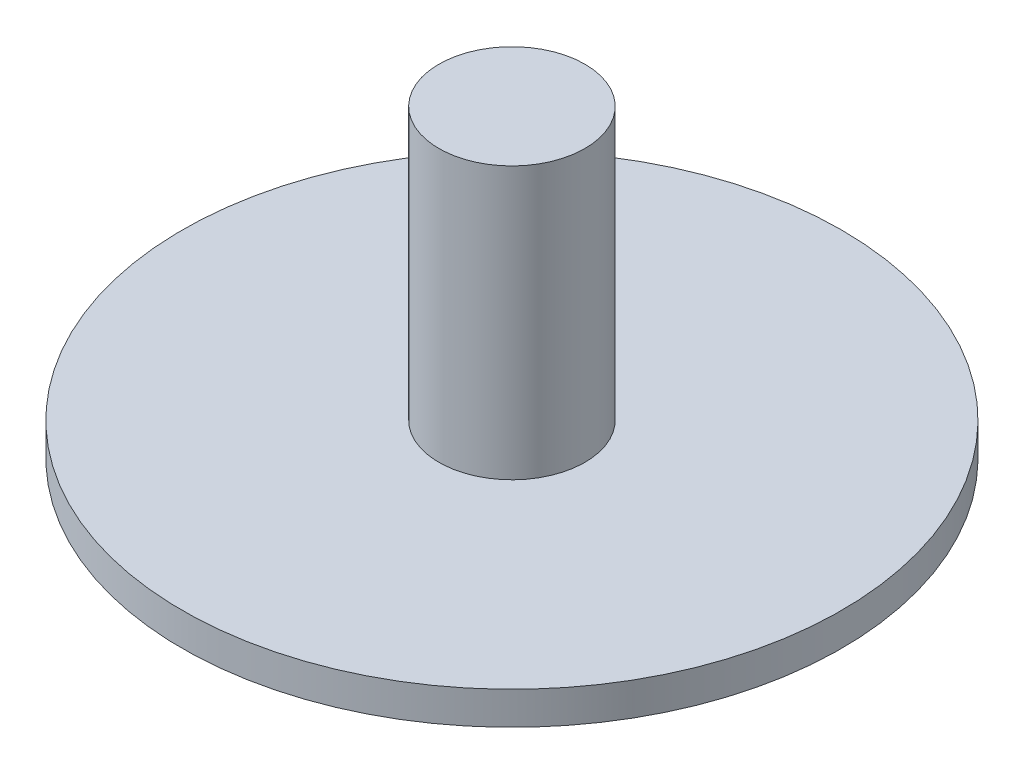
ISO-10303-21;
HEADER;
FILE_DESCRIPTION(('STEP AP214'),'2;1');
FILE_NAME('part.step','',(''),(''),'','','');
FILE_SCHEMA(('AUTOMOTIVE_DESIGN { 1 0 10303 214 1 1 1 1 }'));
ENDSEC;
DATA;
#1=APPLICATION_CONTEXT('core data for automotive mechanical design processes');
#2=APPLICATION_PROTOCOL_DEFINITION('international standard','automotive_design',2000,#1);
#3=PRODUCT_CONTEXT('',#1,'mechanical');
#4=PRODUCT('Part','Part','',(#3));
#5=PRODUCT_RELATED_PRODUCT_CATEGORY('part','',(#4));
#6=PRODUCT_DEFINITION_FORMATION('','',#4);
#7=PRODUCT_DEFINITION_CONTEXT('part definition',#1,'design');
#8=PRODUCT_DEFINITION('design','',#6,#7);
#9=PRODUCT_DEFINITION_SHAPE('','',#8);
#10=(LENGTH_UNIT() NAMED_UNIT(*) SI_UNIT(.MILLI.,.METRE.));
#11=(NAMED_UNIT(*) PLANE_ANGLE_UNIT() SI_UNIT($,.RADIAN.));
#12=(NAMED_UNIT(*) SI_UNIT($,.STERADIAN.) SOLID_ANGLE_UNIT());
#13=UNCERTAINTY_MEASURE_WITH_UNIT(LENGTH_MEASURE(1.E-05),#10,'distance_accuracy_value','');
#14=(GEOMETRIC_REPRESENTATION_CONTEXT(3) GLOBAL_UNCERTAINTY_ASSIGNED_CONTEXT((#13)) GLOBAL_UNIT_ASSIGNED_CONTEXT((#10,
#11,#12)) REPRESENTATION_CONTEXT('',''));
#15=CARTESIAN_POINT('',(0.,0.,0.));
#16=DIRECTION('',(0.,0.,1.));
#17=DIRECTION('',(1.,0.,0.));
#18=AXIS2_PLACEMENT_3D('',#15,#16,#17);
#19=CARTESIAN_POINT('',(0.,40.,0.));
#20=DIRECTION('',(0.,1.,0.));
#21=DIRECTION('',(0.,0.,1.));
#22=AXIS2_PLACEMENT_3D('',#19,#20,#21);
#23=PLANE('',#22);
#24=CARTESIAN_POINT('',(0.,40.,0.));
#25=DIRECTION('',(0.,-1.,0.));
#26=DIRECTION('',(0.,0.,-1.));
#27=AXIS2_PLACEMENT_3D('',#24,#25,#26);
#28=CIRCLE('',#27,5.54070105234821);
#29=CARTESIAN_POINT('',(0.,40.,-5.54070105234821));
#30=VERTEX_POINT('',#29);
#31=EDGE_CURVE('E93',#30,#30,#28,.T.);
#32=ORIENTED_EDGE('',*,*,#31,.F.);
#33=EDGE_LOOP('',(#32));
#34=FACE_BOUND('',#33,.T.);
#35=ADVANCED_FACE('F37',(#34),#23,.T.);
#36=CARTESIAN_POINT('',(0.,0.,0.));
#37=DIRECTION('',(0.,-1.,0.));
#38=DIRECTION('',(0.,0.,-1.));
#39=AXIS2_PLACEMENT_3D('',#36,#37,#38);
#40=CYLINDRICAL_SURFACE('',#39,5.54070105234821);
#41=ORIENTED_EDGE('',*,*,#31,.T.);
#42=EDGE_LOOP('',(#41));
#43=FACE_BOUND('',#42,.T.);
#44=CARTESIAN_POINT('',(0.,19.3820717512354,0.));
#45=DIRECTION('',(0.,-1.,0.));
#46=DIRECTION('',(0.,0.,-1.));
#47=AXIS2_PLACEMENT_3D('',#44,#45,#46);
#48=CIRCLE('',#47,5.54070105234821);
#49=CARTESIAN_POINT('',(0.,19.3820717512354,-5.54070105234821));
#50=VERTEX_POINT('',#49);
#51=EDGE_CURVE('E88',#50,#50,#48,.T.);
#52=ORIENTED_EDGE('',*,*,#51,.F.);
#53=EDGE_LOOP('',(#52));
#54=FACE_BOUND('',#53,.T.);
#55=ADVANCED_FACE('F62',(#43,#54),#40,.T.);
#56=CARTESIAN_POINT('',(0.,19.3820717512354,-5.54070105234821));
#57=DIRECTION('',(0.,1.,0.));
#58=DIRECTION('',(0.,0.,1.));
#59=AXIS2_PLACEMENT_3D('',#56,#57,#58);
#60=PLANE('',#59);
#61=ORIENTED_EDGE('',*,*,#51,.T.);
#62=EDGE_LOOP('',(#61));
#63=FACE_BOUND('',#62,.T.);
#64=CARTESIAN_POINT('',(0.,19.3820717512354,0.));
#65=DIRECTION('',(0.,-1.,0.));
#66=DIRECTION('',(0.,0.,-1.));
#67=AXIS2_PLACEMENT_3D('',#64,#65,#66);
#68=CIRCLE('',#67,25.);
#69=CARTESIAN_POINT('',(0.,19.3820717512354,-25.));
#70=VERTEX_POINT('',#69);
#71=EDGE_CURVE('E82',#70,#70,#68,.T.);
#72=ORIENTED_EDGE('',*,*,#71,.F.);
#73=EDGE_LOOP('',(#72));
#74=FACE_BOUND('',#73,.T.);
#75=ADVANCED_FACE('F67',(#63,#74),#60,.T.);
#76=CARTESIAN_POINT('',(0.,0.,0.));
#77=DIRECTION('',(0.,-1.,0.));
#78=DIRECTION('',(0.,0.,-1.));
#79=AXIS2_PLACEMENT_3D('',#76,#77,#78);
#80=CYLINDRICAL_SURFACE('',#79,25.);
#81=ORIENTED_EDGE('',*,*,#71,.T.);
#82=EDGE_LOOP('',(#81));
#83=FACE_BOUND('',#82,.T.);
#84=CARTESIAN_POINT('',(0.,16.8820717512354,0.));
#85=DIRECTION('',(0.,-1.,0.));
#86=DIRECTION('',(0.,0.,-1.));
#87=AXIS2_PLACEMENT_3D('',#84,#85,#86);
#88=CIRCLE('',#87,25.);
#89=CARTESIAN_POINT('',(0.,16.8820717512354,-25.));
#90=VERTEX_POINT('',#89);
#91=EDGE_CURVE('E85',#90,#90,#88,.T.);
#92=ORIENTED_EDGE('',*,*,#91,.F.);
#93=EDGE_LOOP('',(#92));
#94=FACE_BOUND('',#93,.T.);
#95=ADVANCED_FACE('F57',(#83,#94),#80,.T.);
#96=CARTESIAN_POINT('',(0.,16.8820717512354,-25.));
#97=DIRECTION('',(0.,-1.,0.));
#98=DIRECTION('',(0.,0.,-1.));
#99=AXIS2_PLACEMENT_3D('',#96,#97,#98);
#100=PLANE('',#99);
#101=CARTESIAN_POINT('',(0.,16.8820717512354,0.));
#102=DIRECTION('',(0.,-1.,0.));
#103=DIRECTION('',(0.,0.,-1.));
#104=AXIS2_PLACEMENT_3D('',#101,#102,#103);
#105=CIRCLE('',#104,23.7989958633106);
#106=CARTESIAN_POINT('',(0.,16.8820717512354,-23.7989958633106));
#107=VERTEX_POINT('',#106);
#108=EDGE_CURVE('E11',#107,#107,#105,.F.);
#109=ORIENTED_EDGE('',*,*,#108,.T.);
#110=EDGE_LOOP('',(#109));
#111=FACE_BOUND('',#110,.T.);
#112=ORIENTED_EDGE('',*,*,#91,.T.);
#113=EDGE_LOOP('',(#112));
#114=FACE_BOUND('',#113,.T.);
#115=ADVANCED_FACE('F49',(#111,#114),#100,.T.);
#116=CARTESIAN_POINT('',(0.,0.,0.));
#117=DIRECTION('',(0.,1.,0.));
#118=DIRECTION('',(0.,0.,1.));
#119=AXIS2_PLACEMENT_3D('',#116,#117,#118);
#120=CONICAL_SURFACE('',#119,0.,0.43633231299858);
#121=CARTESIAN_POINT('',(0.,2.44752829475284,0.));
#122=DIRECTION('',(0.,1.,0.));
#123=DIRECTION('',(0.,0.,1.));
#124=AXIS2_PLACEMENT_3D('',#121,#122,#123);
#125=CIRCLE('',#124,1.14130118739429);
#126=CARTESIAN_POINT('',(0.,2.44752829475284,1.14130118739429));
#127=VERTEX_POINT('',#126);
#128=EDGE_CURVE('E44',#127,#127,#125,.F.);
#129=ORIENTED_EDGE('',*,*,#128,.T.);
#130=EDGE_LOOP('',(#129));
#131=FACE_BOUND('',#130,.T.);
#132=CARTESIAN_POINT('',(0.,0.,0.));
#133=VERTEX_POINT('',#132);
#134=VERTEX_LOOP('',#133);
#135=FACE_BOUND('',#134,.T.);
#136=ADVANCED_FACE('F47',(#131,#135),#120,.T.);
#137=CARTESIAN_POINT('',(0.,-8.11792824876459,0.));
#138=DIRECTION('',(0.,-1.,0.));
#139=DIRECTION('',(0.,0.,-1.));
#140=AXIS2_PLACEMENT_3D('',#137,#138,#139);
#141=DEGENERATE_TOROIDAL_SURFACE('',#140,23.7989958633106,25.,.T.);
#142=ORIENTED_EDGE('',*,*,#108,.F.);
#143=EDGE_LOOP('',(#142));
#144=FACE_BOUND('',#143,.T.);
#145=ORIENTED_EDGE('',*,*,#128,.F.);
#146=EDGE_LOOP('',(#145));
#147=FACE_BOUND('',#146,.T.);
#148=ADVANCED_FACE('F39',(#144,#147),#141,.F.);
#149=CLOSED_SHELL('',(#35,#55,#75,#95,#115,#136,#148));
#150=MANIFOLD_SOLID_BREP('B2',#149);
#151=ADVANCED_BREP_SHAPE_REPRESENTATION('',(#18,#150),#14);
#152=SHAPE_DEFINITION_REPRESENTATION(#9,#151);
ENDSEC;
END-ISO-10303-21;
